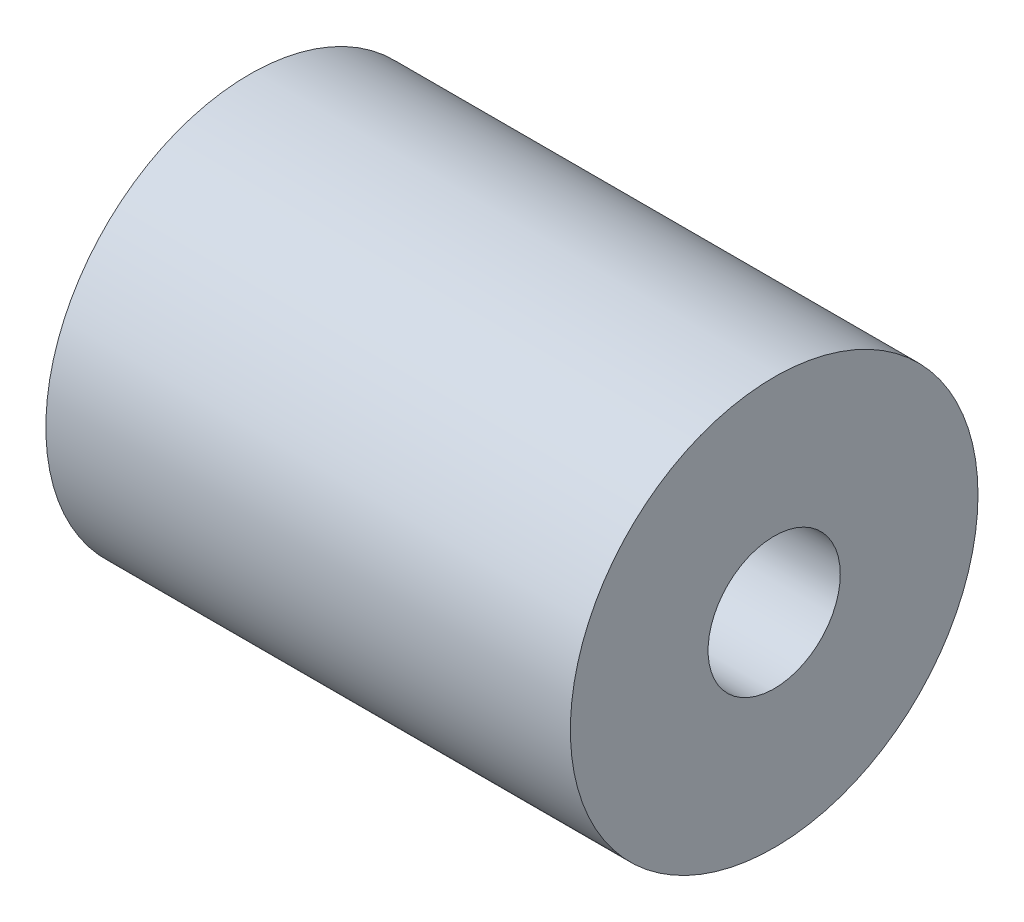
ISO-10303-21;
HEADER;
FILE_DESCRIPTION(('STEP AP214'),'2;1');
FILE_NAME('part.step','',(''),(''),'','','');
FILE_SCHEMA(('AUTOMOTIVE_DESIGN { 1 0 10303 214 1 1 1 1 }'));
ENDSEC;
DATA;
#1=APPLICATION_CONTEXT('core data for automotive mechanical design processes');
#2=APPLICATION_PROTOCOL_DEFINITION('international standard','automotive_design',2000,#1);
#3=PRODUCT_CONTEXT('',#1,'mechanical');
#4=PRODUCT('Part','Part','',(#3));
#5=PRODUCT_RELATED_PRODUCT_CATEGORY('part','',(#4));
#6=PRODUCT_DEFINITION_FORMATION('','',#4);
#7=PRODUCT_DEFINITION_CONTEXT('part definition',#1,'design');
#8=PRODUCT_DEFINITION('design','',#6,#7);
#9=PRODUCT_DEFINITION_SHAPE('','',#8);
#10=(LENGTH_UNIT() NAMED_UNIT(*) SI_UNIT(.MILLI.,.METRE.));
#11=(NAMED_UNIT(*) PLANE_ANGLE_UNIT() SI_UNIT($,.RADIAN.));
#12=(NAMED_UNIT(*) SI_UNIT($,.STERADIAN.) SOLID_ANGLE_UNIT());
#13=UNCERTAINTY_MEASURE_WITH_UNIT(LENGTH_MEASURE(1.E-05),#10,'distance_accuracy_value','');
#14=(GEOMETRIC_REPRESENTATION_CONTEXT(3) GLOBAL_UNCERTAINTY_ASSIGNED_CONTEXT((#13)) GLOBAL_UNIT_ASSIGNED_CONTEXT((#10,
#11,#12)) REPRESENTATION_CONTEXT('',''));
#15=CARTESIAN_POINT('',(0.,0.,0.));
#16=DIRECTION('',(0.,0.,1.));
#17=DIRECTION('',(1.,0.,0.));
#18=AXIS2_PLACEMENT_3D('',#15,#16,#17);
#19=CARTESIAN_POINT('',(25.,9.465,0.));
#20=DIRECTION('',(1.,0.,0.));
#21=DIRECTION('',(0.,0.,-1.));
#22=AXIS2_PLACEMENT_3D('',#19,#20,#21);
#23=PLANE('',#22);
#24=CARTESIAN_POINT('',(25.,9.465,0.));
#25=DIRECTION('',(1.,0.,0.));
#26=DIRECTION('',(0.,0.,-1.));
#27=AXIS2_PLACEMENT_3D('',#24,#25,#26);
#28=CIRCLE('',#27,9.715);
#29=CARTESIAN_POINT('',(25.,9.465,-9.715));
#30=VERTEX_POINT('',#29);
#31=EDGE_CURVE('E10',#30,#30,#28,.T.);
#32=ORIENTED_EDGE('',*,*,#31,.T.);
#33=EDGE_LOOP('',(#32));
#34=FACE_BOUND('',#33,.T.);
#35=CARTESIAN_POINT('',(25.,9.465,0.));
#36=DIRECTION('',(1.,0.,0.));
#37=DIRECTION('',(0.,0.,-1.));
#38=AXIS2_PLACEMENT_3D('',#35,#36,#37);
#39=CIRCLE('',#38,3.15);
#40=CARTESIAN_POINT('',(25.,9.465,-3.15));
#41=VERTEX_POINT('',#40);
#42=EDGE_CURVE('E44',#41,#41,#39,.T.);
#43=ORIENTED_EDGE('',*,*,#42,.F.);
#44=EDGE_LOOP('',(#43));
#45=FACE_BOUND('',#44,.T.);
#46=ADVANCED_FACE('F33',(#34,#45),#23,.T.);
#47=CARTESIAN_POINT('',(0.,9.465,0.));
#48=DIRECTION('',(1.,0.,0.));
#49=DIRECTION('',(0.,0.,-1.));
#50=AXIS2_PLACEMENT_3D('',#47,#48,#49);
#51=PLANE('',#50);
#52=CARTESIAN_POINT('',(0.,9.465,0.));
#53=DIRECTION('',(1.,0.,0.));
#54=DIRECTION('',(0.,0.,-1.));
#55=AXIS2_PLACEMENT_3D('',#52,#53,#54);
#56=CIRCLE('',#55,9.715);
#57=CARTESIAN_POINT('',(0.,9.465,-9.715));
#58=VERTEX_POINT('',#57);
#59=EDGE_CURVE('E37',#58,#58,#56,.T.);
#60=ORIENTED_EDGE('',*,*,#59,.F.);
#61=EDGE_LOOP('',(#60));
#62=FACE_BOUND('',#61,.T.);
#63=CARTESIAN_POINT('',(0.,9.465,0.));
#64=DIRECTION('',(1.,0.,0.));
#65=DIRECTION('',(0.,0.,-1.));
#66=AXIS2_PLACEMENT_3D('',#63,#64,#65);
#67=CIRCLE('',#66,3.15);
#68=CARTESIAN_POINT('',(0.,9.465,-3.15));
#69=VERTEX_POINT('',#68);
#70=EDGE_CURVE('E46',#69,#69,#67,.T.);
#71=ORIENTED_EDGE('',*,*,#70,.T.);
#72=EDGE_LOOP('',(#71));
#73=FACE_BOUND('',#72,.T.);
#74=ADVANCED_FACE('F56',(#62,#73),#51,.F.);
#75=CARTESIAN_POINT('',(25.,9.465,0.));
#76=DIRECTION('',(-1.,0.,0.));
#77=DIRECTION('',(0.,0.,1.));
#78=AXIS2_PLACEMENT_3D('',#75,#76,#77);
#79=CYLINDRICAL_SURFACE('',#78,9.715);
#80=ORIENTED_EDGE('',*,*,#31,.F.);
#81=EDGE_LOOP('',(#80));
#82=FACE_BOUND('',#81,.T.);
#83=ORIENTED_EDGE('',*,*,#59,.T.);
#84=EDGE_LOOP('',(#83));
#85=FACE_BOUND('',#84,.T.);
#86=ADVANCED_FACE('F35',(#82,#85),#79,.T.);
#87=CARTESIAN_POINT('',(25.,9.465,0.));
#88=DIRECTION('',(-1.,0.,0.));
#89=DIRECTION('',(0.,0.,1.));
#90=AXIS2_PLACEMENT_3D('',#87,#88,#89);
#91=CYLINDRICAL_SURFACE('',#90,3.15);
#92=ORIENTED_EDGE('',*,*,#42,.T.);
#93=EDGE_LOOP('',(#92));
#94=FACE_BOUND('',#93,.T.);
#95=ORIENTED_EDGE('',*,*,#70,.F.);
#96=EDGE_LOOP('',(#95));
#97=FACE_BOUND('',#96,.T.);
#98=ADVANCED_FACE('F52',(#94,#97),#91,.F.);
#99=CLOSED_SHELL('',(#46,#74,#86,#98));
#100=MANIFOLD_SOLID_BREP('B2',#99);
#101=ADVANCED_BREP_SHAPE_REPRESENTATION('',(#18,#100),#14);
#102=SHAPE_DEFINITION_REPRESENTATION(#9,#101);
ENDSEC;
END-ISO-10303-21;
